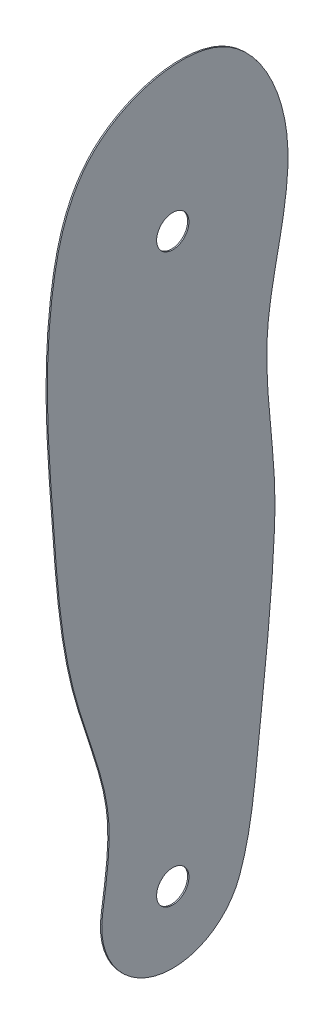
ISO-10303-21;
HEADER;
FILE_DESCRIPTION(('STEP AP214'),'2;1');
FILE_NAME('part.step','',(''),(''),'','','');
FILE_SCHEMA(('AUTOMOTIVE_DESIGN { 1 0 10303 214 1 1 1 1 }'));
ENDSEC;
DATA;
#1=APPLICATION_CONTEXT('core data for automotive mechanical design processes');
#2=APPLICATION_PROTOCOL_DEFINITION('international standard','automotive_design',2000,#1);
#3=PRODUCT_CONTEXT('',#1,'mechanical');
#4=PRODUCT('Part','Part','',(#3));
#5=PRODUCT_RELATED_PRODUCT_CATEGORY('part','',(#4));
#6=PRODUCT_DEFINITION_FORMATION('','',#4);
#7=PRODUCT_DEFINITION_CONTEXT('part definition',#1,'design');
#8=PRODUCT_DEFINITION('design','',#6,#7);
#9=PRODUCT_DEFINITION_SHAPE('','',#8);
#10=(LENGTH_UNIT() NAMED_UNIT(*) SI_UNIT(.MILLI.,.METRE.));
#11=(NAMED_UNIT(*) PLANE_ANGLE_UNIT() SI_UNIT($,.RADIAN.));
#12=(NAMED_UNIT(*) SI_UNIT($,.STERADIAN.) SOLID_ANGLE_UNIT());
#13=UNCERTAINTY_MEASURE_WITH_UNIT(LENGTH_MEASURE(1.E-05),#10,'distance_accuracy_value','');
#14=(GEOMETRIC_REPRESENTATION_CONTEXT(3) GLOBAL_UNCERTAINTY_ASSIGNED_CONTEXT((#13)) GLOBAL_UNIT_ASSIGNED_CONTEXT((#10,
#11,#12)) REPRESENTATION_CONTEXT('',''));
#15=CARTESIAN_POINT('',(0.,0.,0.));
#16=DIRECTION('',(0.,0.,1.));
#17=DIRECTION('',(1.,0.,0.));
#18=AXIS2_PLACEMENT_3D('',#15,#16,#17);
#19=CARTESIAN_POINT('',(0.5,110.989874526096,-11.2828058736245));
#20=DIRECTION('',(-1.,0.,0.));
#21=DIRECTION('',(0.,0.,1.));
#22=AXIS2_PLACEMENT_3D('',#19,#20,#21);
#23=PLANE('',#22);
#24=CARTESIAN_POINT('',(0.5,-457.592207732517,-51.7924621573534));
#25=CARTESIAN_POINT('',(0.5,-434.17439455853,-60.1607377369607));
#26=CARTESIAN_POINT('',(0.5,-363.130683174632,-67.4885578176118));
#27=CARTESIAN_POINT('',(0.5,-282.101541179878,-77.211652355777));
#28=CARTESIAN_POINT('',(0.5,-188.942019152266,-80.6409398110024));
#29=CARTESIAN_POINT('',(0.5,-97.6292471268352,-61.2271864718727));
#30=CARTESIAN_POINT('',(0.5,11.19342408371,-106.857747087596));
#31=CARTESIAN_POINT('',(0.5,128.828975778907,-47.1237086874921));
#32=CARTESIAN_POINT('',(0.5,98.5223227423476,73.2114521916076));
#33=CARTESIAN_POINT('',(0.5,-20.0158324490626,102.635455482303));
#34=CARTESIAN_POINT('',(0.5,-140.958198900465,92.6575541919021));
#35=CARTESIAN_POINT('',(0.5,-265.66485605682,84.605008828259));
#36=CARTESIAN_POINT('',(0.5,-358.409103601022,43.7725980012047));
#37=CARTESIAN_POINT('',(0.5,-405.518540427784,50.6651352017362));
#38=CARTESIAN_POINT('',(0.5,-430.120531800336,54.2646293193594));
#39=B_SPLINE_CURVE_WITH_KNOTS('',3,(#24,#25,#26,#27,#28,#29,#30,#31,#32,#33,#34,#35,#36,#37,
#38),.UNSPECIFIED.,.F.,.F.,(4,1,1,1,1,1,1,1,1,1,1,1,4),(0.,0.0605651406649175,0.171944769885035,
0.195187912107165,0.292996562886222,0.398656702683543,0.479109559545362,0.561345808335818,
0.633895113308269,0.762588455054262,0.868560810265153,0.947252355176831,1.),.UNSPECIFIED.);
#40=CARTESIAN_POINT('',(0.5,-457.592207732517,-51.7924621573534));
#41=VERTEX_POINT('',#40);
#42=CARTESIAN_POINT('',(0.5,-430.120531800336,54.2646293193594));
#43=VERTEX_POINT('',#42);
#44=EDGE_CURVE('E67',#41,#43,#39,.T.);
#45=ORIENTED_EDGE('',*,*,#44,.T.);
#46=CARTESIAN_POINT('',(0.5,-439.084348221511,0.));
#47=DIRECTION('',(1.,0.,0.));
#48=DIRECTION('',(0.,0.,-1.));
#49=AXIS2_PLACEMENT_3D('',#46,#47,#48);
#50=CIRCLE('',#49,55.);
#51=EDGE_CURVE('E52',#43,#41,#50,.T.);
#52=ORIENTED_EDGE('',*,*,#51,.T.);
#53=EDGE_LOOP('',(#45,#52));
#54=FACE_BOUND('',#53,.T.);
#55=CARTESIAN_POINT('',(0.5,0.,0.));
#56=DIRECTION('',(1.,0.,0.));
#57=DIRECTION('',(0.,0.,-1.));
#58=AXIS2_PLACEMENT_3D('',#55,#56,#57);
#59=CIRCLE('',#58,12.5);
#60=CARTESIAN_POINT('',(0.5,0.,-12.5));
#61=VERTEX_POINT('',#60);
#62=EDGE_CURVE('E73',#61,#61,#59,.T.);
#63=ORIENTED_EDGE('',*,*,#62,.F.);
#64=EDGE_LOOP('',(#63));
#65=FACE_BOUND('',#64,.T.);
#66=CARTESIAN_POINT('',(0.5,-439.084348221511,0.));
#67=DIRECTION('',(1.,0.,0.));
#68=DIRECTION('',(0.,0.,-1.));
#69=AXIS2_PLACEMENT_3D('',#66,#67,#68);
#70=CIRCLE('',#69,12.5);
#71=CARTESIAN_POINT('',(0.5,-439.084348221511,-12.5));
#72=VERTEX_POINT('',#71);
#73=EDGE_CURVE('E92',#72,#72,#70,.T.);
#74=ORIENTED_EDGE('',*,*,#73,.F.);
#75=EDGE_LOOP('',(#74));
#76=FACE_BOUND('',#75,.T.);
#77=ADVANCED_FACE('F35',(#54,#65,#76),#23,.F.);
#78=CARTESIAN_POINT('',(-0.5,110.989874526096,-11.2828058736245));
#79=DIRECTION('',(-1.,0.,0.));
#80=DIRECTION('',(0.,0.,1.));
#81=AXIS2_PLACEMENT_3D('',#78,#79,#80);
#82=PLANE('',#81);
#83=CARTESIAN_POINT('',(-0.5,0.,0.));
#84=DIRECTION('',(1.,0.,0.));
#85=DIRECTION('',(0.,0.,-1.));
#86=AXIS2_PLACEMENT_3D('',#83,#84,#85);
#87=CIRCLE('',#86,12.5);
#88=CARTESIAN_POINT('',(-0.5,0.,-12.5));
#89=VERTEX_POINT('',#88);
#90=EDGE_CURVE('E76',#89,#89,#87,.T.);
#91=ORIENTED_EDGE('',*,*,#90,.T.);
#92=EDGE_LOOP('',(#91));
#93=FACE_BOUND('',#92,.T.);
#94=CARTESIAN_POINT('',(-0.5,-457.592207732517,-51.7924621573534));
#95=CARTESIAN_POINT('',(-0.5,-434.17439455853,-60.1607377369607));
#96=CARTESIAN_POINT('',(-0.5,-363.130683174632,-67.4885578176118));
#97=CARTESIAN_POINT('',(-0.5,-282.101541179878,-77.211652355777));
#98=CARTESIAN_POINT('',(-0.5,-188.942019152266,-80.6409398110024));
#99=CARTESIAN_POINT('',(-0.5,-97.6292471268352,-61.2271864718727));
#100=CARTESIAN_POINT('',(-0.5,11.19342408371,-106.857747087596));
#101=CARTESIAN_POINT('',(-0.5,128.828975778907,-47.1237086874921));
#102=CARTESIAN_POINT('',(-0.5,98.5223227423476,73.2114521916076));
#103=CARTESIAN_POINT('',(-0.5,-20.0158324490626,102.635455482303));
#104=CARTESIAN_POINT('',(-0.5,-140.958198900465,92.6575541919021));
#105=CARTESIAN_POINT('',(-0.5,-265.66485605682,84.605008828259));
#106=CARTESIAN_POINT('',(-0.5,-358.409103601022,43.7725980012047));
#107=CARTESIAN_POINT('',(-0.5,-405.518540427784,50.6651352017362));
#108=CARTESIAN_POINT('',(-0.5,-430.120531800336,54.2646293193594));
#109=B_SPLINE_CURVE_WITH_KNOTS('',3,(#94,#95,#96,#97,#98,#99,#100,#101,#102,#103,#104,#105,#106,
#107,#108),.UNSPECIFIED.,.F.,.F.,(4,1,1,1,1,1,1,1,1,1,1,1,4),(0.,0.0605651406649175,
0.171944769885035,0.195187912107165,0.292996562886222,0.398656702683543,0.479109559545362,
0.561345808335818,0.633895113308269,0.762588455054262,0.868560810265153,0.947252355176831,1.),.UNSPECIFIED.);
#110=CARTESIAN_POINT('',(-0.5,-457.592207732517,-51.7924621573534));
#111=VERTEX_POINT('',#110);
#112=CARTESIAN_POINT('',(-0.5,-430.120531800336,54.2646293193594));
#113=VERTEX_POINT('',#112);
#114=EDGE_CURVE('E68',#111,#113,#109,.T.);
#115=ORIENTED_EDGE('',*,*,#114,.F.);
#116=CARTESIAN_POINT('',(-0.5,-439.084348221511,0.));
#117=DIRECTION('',(1.,0.,0.));
#118=DIRECTION('',(0.,0.,-1.));
#119=AXIS2_PLACEMENT_3D('',#116,#117,#118);
#120=CIRCLE('',#119,55.);
#121=EDGE_CURVE('E60',#113,#111,#120,.T.);
#122=ORIENTED_EDGE('',*,*,#121,.F.);
#123=EDGE_LOOP('',(#115,#122));
#124=FACE_BOUND('',#123,.T.);
#125=CARTESIAN_POINT('',(-0.5,-439.084348221511,0.));
#126=DIRECTION('',(1.,0.,0.));
#127=DIRECTION('',(0.,0.,-1.));
#128=AXIS2_PLACEMENT_3D('',#125,#126,#127);
#129=CIRCLE('',#128,12.5);
#130=CARTESIAN_POINT('',(-0.5,-439.084348221511,-12.5));
#131=VERTEX_POINT('',#130);
#132=EDGE_CURVE('E94',#131,#131,#129,.T.);
#133=ORIENTED_EDGE('',*,*,#132,.T.);
#134=EDGE_LOOP('',(#133));
#135=FACE_BOUND('',#134,.T.);
#136=ADVANCED_FACE('F71',(#93,#124,#135),#82,.T.);
#137=DIRECTION('',(-1.,0.,0.));
#138=VECTOR('',#137,1.);
#139=SURFACE_OF_LINEAR_EXTRUSION('',#39,#138);
#140=ORIENTED_EDGE('',*,*,#114,.T.);
#141=DIRECTION('',(-1.,0.,0.));
#142=VECTOR('',#141,1.);
#143=CARTESIAN_POINT('',(0.5,-430.120531800336,54.2646293193594));
#144=LINE('',#143,#142);
#145=EDGE_CURVE('E11',#43,#113,#144,.T.);
#146=ORIENTED_EDGE('',*,*,#145,.F.);
#147=ORIENTED_EDGE('',*,*,#44,.F.);
#148=DIRECTION('',(-1.,0.,0.));
#149=VECTOR('',#148,1.);
#150=CARTESIAN_POINT('',(0.5,-457.592207732517,-51.7924621573534));
#151=LINE('',#150,#149);
#152=EDGE_CURVE('E45',#41,#111,#151,.T.);
#153=ORIENTED_EDGE('',*,*,#152,.T.);
#154=EDGE_LOOP('',(#140,#146,#147,#153));
#155=FACE_BOUND('',#154,.T.);
#156=ADVANCED_FACE('F37',(#155),#139,.F.);
#157=CARTESIAN_POINT('',(0.5,-439.084348221511,0.));
#158=DIRECTION('',(-1.,0.,0.));
#159=DIRECTION('',(0.,0.,1.));
#160=AXIS2_PLACEMENT_3D('',#157,#158,#159);
#161=CYLINDRICAL_SURFACE('',#160,55.);
#162=ORIENTED_EDGE('',*,*,#121,.T.);
#163=ORIENTED_EDGE('',*,*,#152,.F.);
#164=ORIENTED_EDGE('',*,*,#51,.F.);
#165=ORIENTED_EDGE('',*,*,#145,.T.);
#166=EDGE_LOOP('',(#162,#163,#164,#165));
#167=FACE_BOUND('',#166,.T.);
#168=ADVANCED_FACE('F63',(#167),#161,.T.);
#169=CARTESIAN_POINT('',(0.5,0.,0.));
#170=DIRECTION('',(-1.,0.,0.));
#171=DIRECTION('',(0.,0.,1.));
#172=AXIS2_PLACEMENT_3D('',#169,#170,#171);
#173=CYLINDRICAL_SURFACE('',#172,12.5);
#174=ORIENTED_EDGE('',*,*,#62,.T.);
#175=EDGE_LOOP('',(#174));
#176=FACE_BOUND('',#175,.T.);
#177=ORIENTED_EDGE('',*,*,#90,.F.);
#178=EDGE_LOOP('',(#177));
#179=FACE_BOUND('',#178,.T.);
#180=ADVANCED_FACE('F112',(#176,#179),#173,.F.);
#181=CARTESIAN_POINT('',(0.5,-439.084348221511,0.));
#182=DIRECTION('',(-1.,0.,0.));
#183=DIRECTION('',(0.,0.,1.));
#184=AXIS2_PLACEMENT_3D('',#181,#182,#183);
#185=CYLINDRICAL_SURFACE('',#184,12.5);
#186=ORIENTED_EDGE('',*,*,#73,.T.);
#187=EDGE_LOOP('',(#186));
#188=FACE_BOUND('',#187,.T.);
#189=ORIENTED_EDGE('',*,*,#132,.F.);
#190=EDGE_LOOP('',(#189));
#191=FACE_BOUND('',#190,.T.);
#192=ADVANCED_FACE('F100',(#188,#191),#185,.F.);
#193=CLOSED_SHELL('',(#77,#136,#156,#168,#180,#192));
#194=MANIFOLD_SOLID_BREP('B2',#193);
#195=ADVANCED_BREP_SHAPE_REPRESENTATION('',(#18,#194),#14);
#196=SHAPE_DEFINITION_REPRESENTATION(#9,#195);
ENDSEC;
END-ISO-10303-21;
